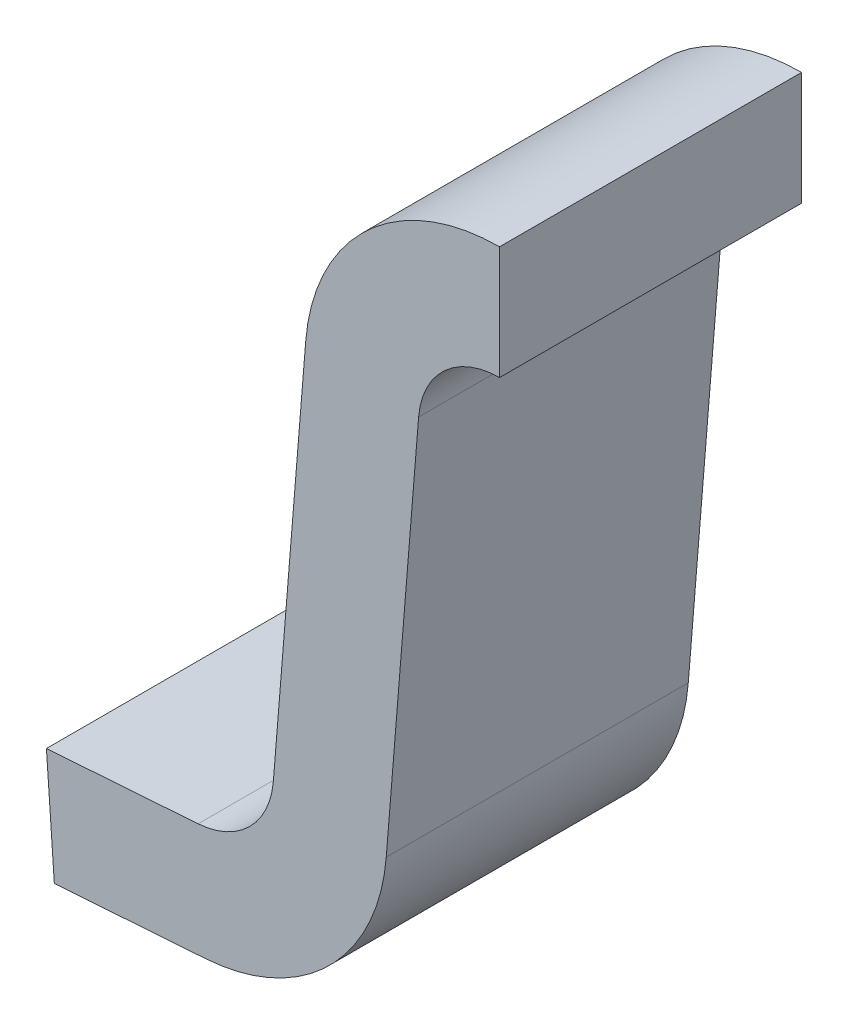
ISO-10303-21;
HEADER;
FILE_DESCRIPTION(('STEP AP214'),'2;1');
FILE_NAME('part.step','',(''),(''),'','','');
FILE_SCHEMA(('AUTOMOTIVE_DESIGN { 1 0 10303 214 1 1 1 1 }'));
ENDSEC;
DATA;
#1=APPLICATION_CONTEXT('core data for automotive mechanical design processes');
#2=APPLICATION_PROTOCOL_DEFINITION('international standard','automotive_design',2000,#1);
#3=PRODUCT_CONTEXT('',#1,'mechanical');
#4=PRODUCT('Part','Part','',(#3));
#5=PRODUCT_RELATED_PRODUCT_CATEGORY('part','',(#4));
#6=PRODUCT_DEFINITION_FORMATION('','',#4);
#7=PRODUCT_DEFINITION_CONTEXT('part definition',#1,'design');
#8=PRODUCT_DEFINITION('design','',#6,#7);
#9=PRODUCT_DEFINITION_SHAPE('','',#8);
#10=(LENGTH_UNIT() NAMED_UNIT(*) SI_UNIT(.MILLI.,.METRE.));
#11=(NAMED_UNIT(*) PLANE_ANGLE_UNIT() SI_UNIT($,.RADIAN.));
#12=(NAMED_UNIT(*) SI_UNIT($,.STERADIAN.) SOLID_ANGLE_UNIT());
#13=UNCERTAINTY_MEASURE_WITH_UNIT(LENGTH_MEASURE(1.E-05),#10,'distance_accuracy_value','');
#14=(GEOMETRIC_REPRESENTATION_CONTEXT(3) GLOBAL_UNCERTAINTY_ASSIGNED_CONTEXT((#13)) GLOBAL_UNIT_ASSIGNED_CONTEXT((#10,
#11,#12)) REPRESENTATION_CONTEXT('',''));
#15=CARTESIAN_POINT('',(0.,0.,0.));
#16=DIRECTION('',(0.,0.,1.));
#17=DIRECTION('',(1.,0.,0.));
#18=AXIS2_PLACEMENT_3D('',#15,#16,#17);
#19=CARTESIAN_POINT('',(-0.8,0.767512637046,0.2));
#20=DIRECTION('',(0.,0.,-1.));
#21=DIRECTION('',(-1.,0.,0.));
#22=AXIS2_PLACEMENT_3D('',#19,#20,#21);
#23=CYLINDRICAL_SURFACE('',#22,0.107487362954);
#24=CARTESIAN_POINT('',(-0.8,0.767512637046,-0.2));
#25=DIRECTION('',(0.,0.,-1.));
#26=DIRECTION('',(1.,0.,0.));
#27=AXIS2_PLACEMENT_3D('',#24,#25,#26);
#28=CIRCLE('',#27,0.107487362954);
#29=CARTESIAN_POINT('',(-0.907132499112,0.776239654222,-0.2));
#30=VERTEX_POINT('',#29);
#31=CARTESIAN_POINT('',(-0.8,0.875,-0.2));
#32=VERTEX_POINT('',#31);
#33=EDGE_CURVE('E11',#30,#32,#28,.T.);
#34=ORIENTED_EDGE('',*,*,#33,.T.);
#35=DIRECTION('',(0.,0.,-1.));
#36=VECTOR('',#35,1.);
#37=CARTESIAN_POINT('',(-0.8,0.875,0.2));
#38=LINE('',#37,#36);
#39=CARTESIAN_POINT('',(-0.8,0.875,0.2));
#40=VERTEX_POINT('',#39);
#41=EDGE_CURVE('E36',#40,#32,#38,.T.);
#42=ORIENTED_EDGE('',*,*,#41,.F.);
#43=CARTESIAN_POINT('',(-0.8,0.767512637046,0.2));
#44=DIRECTION('',(0.,0.,-1.));
#45=DIRECTION('',(1.,0.,0.));
#46=AXIS2_PLACEMENT_3D('',#43,#44,#45);
#47=CIRCLE('',#46,0.107487362954);
#48=CARTESIAN_POINT('',(-0.907132499112,0.776239654222,0.2));
#49=VERTEX_POINT('',#48);
#50=EDGE_CURVE('E110',#49,#40,#47,.T.);
#51=ORIENTED_EDGE('',*,*,#50,.F.);
#52=DIRECTION('',(0.,0.,-1.));
#53=VECTOR('',#52,1.);
#54=CARTESIAN_POINT('',(-0.907132499112,0.776239654222,0.2));
#55=LINE('',#54,#53);
#56=EDGE_CURVE('E27',#49,#30,#55,.T.);
#57=ORIENTED_EDGE('',*,*,#56,.T.);
#58=EDGE_LOOP('',(#34,#42,#51,#57));
#59=FACE_BOUND('',#58,.T.);
#60=ADVANCED_FACE('F17',(#59),#23,.F.);
#61=CARTESIAN_POINT('',(-0.8,1.025,0.2));
#62=DIRECTION('',(-1.,0.,0.));
#63=DIRECTION('',(0.,0.,1.));
#64=AXIS2_PLACEMENT_3D('',#61,#62,#63);
#65=PLANE('',#64);
#66=DIRECTION('',(0.,1.,0.));
#67=VECTOR('',#66,1.);
#68=CARTESIAN_POINT('',(-0.8,1.025,-0.2));
#69=LINE('',#68,#67);
#70=CARTESIAN_POINT('',(-0.8,1.025,-0.2));
#71=VERTEX_POINT('',#70);
#72=EDGE_CURVE('E117',#32,#71,#69,.T.);
#73=ORIENTED_EDGE('',*,*,#72,.T.);
#74=DIRECTION('',(0.,0.,-1.));
#75=VECTOR('',#74,1.);
#76=CARTESIAN_POINT('',(-0.8,1.025,0.2));
#77=LINE('',#76,#75);
#78=CARTESIAN_POINT('',(-0.8,1.025,0.2));
#79=VERTEX_POINT('',#78);
#80=EDGE_CURVE('E123',#79,#71,#77,.T.);
#81=ORIENTED_EDGE('',*,*,#80,.F.);
#82=DIRECTION('',(0.,1.,0.));
#83=VECTOR('',#82,1.);
#84=CARTESIAN_POINT('',(-0.8,1.025,0.2));
#85=LINE('',#84,#83);
#86=EDGE_CURVE('E127',#40,#79,#85,.T.);
#87=ORIENTED_EDGE('',*,*,#86,.F.);
#88=ORIENTED_EDGE('',*,*,#41,.T.);
#89=EDGE_LOOP('',(#73,#81,#87,#88));
#90=FACE_BOUND('',#89,.T.);
#91=ADVANCED_FACE('F177',(#90),#65,.F.);
#92=CARTESIAN_POINT('',(-0.8,0.767512637046,0.2));
#93=DIRECTION('',(0.,0.,-1.));
#94=DIRECTION('',(-1.,0.,0.));
#95=AXIS2_PLACEMENT_3D('',#92,#93,#94);
#96=CYLINDRICAL_SURFACE('',#95,0.257487362954);
#97=CARTESIAN_POINT('',(-0.8,0.767512637046,-0.2));
#98=DIRECTION('',(0.,0.,1.));
#99=DIRECTION('',(1.,0.,0.));
#100=AXIS2_PLACEMENT_3D('',#97,#98,#99);
#101=CIRCLE('',#100,0.257487362954);
#102=CARTESIAN_POINT('',(-1.056637282048,0.788418319139,-0.2));
#103=VERTEX_POINT('',#102);
#104=EDGE_CURVE('E125',#71,#103,#101,.T.);
#105=ORIENTED_EDGE('',*,*,#104,.T.);
#106=DIRECTION('',(0.,0.,-1.));
#107=VECTOR('',#106,1.);
#108=CARTESIAN_POINT('',(-1.056637282048,0.788418319139,0.2));
#109=LINE('',#108,#107);
#110=CARTESIAN_POINT('',(-1.056637282048,0.788418319139,0.2));
#111=VERTEX_POINT('',#110);
#112=EDGE_CURVE('E132',#111,#103,#109,.T.);
#113=ORIENTED_EDGE('',*,*,#112,.F.);
#114=CARTESIAN_POINT('',(-0.8,0.767512637046,0.2));
#115=DIRECTION('',(0.,0.,1.));
#116=DIRECTION('',(1.,0.,0.));
#117=AXIS2_PLACEMENT_3D('',#114,#115,#116);
#118=CIRCLE('',#117,0.257487362954);
#119=EDGE_CURVE('E129',#79,#111,#118,.T.);
#120=ORIENTED_EDGE('',*,*,#119,.F.);
#121=ORIENTED_EDGE('',*,*,#80,.T.);
#122=EDGE_LOOP('',(#105,#113,#120,#121));
#123=FACE_BOUND('',#122,.T.);
#124=ADVANCED_FACE('F183',(#123),#96,.T.);
#125=CARTESIAN_POINT('',(-1.056637282048,0.788418319139,0.2));
#126=DIRECTION('',(0.996698552908398,-0.0811910994525024,0.));
#127=DIRECTION('',(0.0811910994525024,0.996698552908398,0.));
#128=AXIS2_PLACEMENT_3D('',#125,#126,#127);
#129=PLANE('',#128);
#130=DIRECTION('',(-0.0811910994525024,-0.996698552908398,0.));
#131=VECTOR('',#130,1.);
#132=CARTESIAN_POINT('',(-1.056637282048,0.788418319139,-0.2));
#133=LINE('',#132,#131);
#134=CARTESIAN_POINT('',(-1.099504782936,0.262178664918,-0.2));
#135=VERTEX_POINT('',#134);
#136=EDGE_CURVE('E126',#103,#135,#133,.T.);
#137=ORIENTED_EDGE('',*,*,#136,.T.);
#138=DIRECTION('',(0.,0.,-1.));
#139=VECTOR('',#138,1.);
#140=CARTESIAN_POINT('',(-1.099504782936,0.262178664918,0.2));
#141=LINE('',#140,#139);
#142=CARTESIAN_POINT('',(-1.099504782936,0.262178664918,0.2));
#143=VERTEX_POINT('',#142);
#144=EDGE_CURVE('E139',#143,#135,#141,.T.);
#145=ORIENTED_EDGE('',*,*,#144,.F.);
#146=DIRECTION('',(-0.0811910994525024,-0.996698552908398,0.));
#147=VECTOR('',#146,1.);
#148=CARTESIAN_POINT('',(-1.056637282048,0.788418319139,0.2));
#149=LINE('',#148,#147);
#150=EDGE_CURVE('E136',#111,#143,#149,.T.);
#151=ORIENTED_EDGE('',*,*,#150,.F.);
#152=ORIENTED_EDGE('',*,*,#112,.T.);
#153=EDGE_LOOP('',(#137,#145,#151,#152));
#154=FACE_BOUND('',#153,.T.);
#155=ADVANCED_FACE('F186',(#154),#129,.F.);
#156=CARTESIAN_POINT('',(-1.206637282048,0.270905682093,0.2));
#157=DIRECTION('',(0.,0.,-1.));
#158=DIRECTION('',(-1.,0.,0.));
#159=AXIS2_PLACEMENT_3D('',#156,#157,#158);
#160=CYLINDRICAL_SURFACE('',#159,0.107487362954);
#161=CARTESIAN_POINT('',(-1.206637282048,0.270905682093,-0.2));
#162=DIRECTION('',(0.,0.,-1.));
#163=DIRECTION('',(-1.,0.,0.));
#164=AXIS2_PLACEMENT_3D('',#161,#162,#163);
#165=CIRCLE('',#164,0.107487362954);
#166=CARTESIAN_POINT('',(-1.199139342637,0.163680152953,-0.2));
#167=VERTEX_POINT('',#166);
#168=EDGE_CURVE('E134',#135,#167,#165,.T.);
#169=ORIENTED_EDGE('',*,*,#168,.T.);
#170=DIRECTION('',(0.,0.,-1.));
#171=VECTOR('',#170,1.);
#172=CARTESIAN_POINT('',(-1.199139342637,0.163680152953,0.2));
#173=LINE('',#172,#171);
#174=CARTESIAN_POINT('',(-1.199139342637,0.163680152953,0.2));
#175=VERTEX_POINT('',#174);
#176=EDGE_CURVE('E146',#175,#167,#173,.T.);
#177=ORIENTED_EDGE('',*,*,#176,.F.);
#178=CARTESIAN_POINT('',(-1.206637282048,0.270905682093,0.2));
#179=DIRECTION('',(0.,0.,-1.));
#180=DIRECTION('',(-1.,0.,0.));
#181=AXIS2_PLACEMENT_3D('',#178,#179,#180);
#182=CIRCLE('',#181,0.107487362954);
#183=EDGE_CURVE('E143',#143,#175,#182,.T.);
#184=ORIENTED_EDGE('',*,*,#183,.F.);
#185=ORIENTED_EDGE('',*,*,#144,.T.);
#186=EDGE_LOOP('',(#169,#177,#184,#185));
#187=FACE_BOUND('',#186,.T.);
#188=ADVANCED_FACE('F191',(#187),#160,.F.);
#189=CARTESIAN_POINT('',(-1.199139342637,0.163680152953,0.2));
#190=DIRECTION('',(0.0697564737441078,-0.997564050259825,0.));
#191=DIRECTION('',(0.997564050259826,0.0697564737441078,0.));
#192=AXIS2_PLACEMENT_3D('',#189,#190,#191);
#193=PLANE('',#192);
#194=DIRECTION('',(-0.997564050259825,-0.0697564737441078,0.));
#195=VECTOR('',#194,1.);
#196=CARTESIAN_POINT('',(-1.199139342637,0.163680152953,-0.2));
#197=LINE('',#196,#195);
#198=CARTESIAN_POINT('',(-1.4,0.149634607539,-0.2));
#199=VERTEX_POINT('',#198);
#200=EDGE_CURVE('E141',#167,#199,#197,.T.);
#201=ORIENTED_EDGE('',*,*,#200,.T.);
#202=DIRECTION('',(0.,0.,-1.));
#203=VECTOR('',#202,1.);
#204=CARTESIAN_POINT('',(-1.4,0.149634607539,0.2));
#205=LINE('',#204,#203);
#206=CARTESIAN_POINT('',(-1.4,0.149634607539,0.2));
#207=VERTEX_POINT('',#206);
#208=EDGE_CURVE('E153',#207,#199,#205,.T.);
#209=ORIENTED_EDGE('',*,*,#208,.F.);
#210=DIRECTION('',(-0.997564050259825,-0.0697564737441078,0.));
#211=VECTOR('',#210,1.);
#212=CARTESIAN_POINT('',(-1.199139342637,0.163680152953,0.2));
#213=LINE('',#212,#211);
#214=EDGE_CURVE('E150',#175,#207,#213,.T.);
#215=ORIENTED_EDGE('',*,*,#214,.F.);
#216=ORIENTED_EDGE('',*,*,#176,.T.);
#217=EDGE_LOOP('',(#201,#209,#215,#216));
#218=FACE_BOUND('',#217,.T.);
#219=ADVANCED_FACE('F196',(#218),#193,.F.);
#220=CARTESIAN_POINT('',(-1.4,0.149634607539,0.2));
#221=DIRECTION('',(0.997564050259825,0.0697564737441078,0.));
#222=DIRECTION('',(-0.0697564737441078,0.997564050259826,0.));
#223=AXIS2_PLACEMENT_3D('',#220,#221,#222);
#224=PLANE('',#223);
#225=DIRECTION('',(0.0697564737441078,-0.997564050259825,0.));
#226=VECTOR('',#225,1.);
#227=CARTESIAN_POINT('',(-1.4,0.149634607539,-0.2));
#228=LINE('',#227,#226);
#229=CARTESIAN_POINT('',(-1.389536528938,0.,-0.2));
#230=VERTEX_POINT('',#229);
#231=EDGE_CURVE('E148',#199,#230,#228,.T.);
#232=ORIENTED_EDGE('',*,*,#231,.T.);
#233=DIRECTION('',(0.,0.,-1.));
#234=VECTOR('',#233,1.);
#235=CARTESIAN_POINT('',(-1.389536528938,0.,0.2));
#236=LINE('',#235,#234);
#237=CARTESIAN_POINT('',(-1.389536528938,0.,0.2));
#238=VERTEX_POINT('',#237);
#239=EDGE_CURVE('E160',#238,#230,#236,.T.);
#240=ORIENTED_EDGE('',*,*,#239,.F.);
#241=DIRECTION('',(0.0697564737441078,-0.997564050259825,0.));
#242=VECTOR('',#241,1.);
#243=CARTESIAN_POINT('',(-1.4,0.149634607539,0.2));
#244=LINE('',#243,#242);
#245=EDGE_CURVE('E157',#207,#238,#244,.T.);
#246=ORIENTED_EDGE('',*,*,#245,.F.);
#247=ORIENTED_EDGE('',*,*,#208,.T.);
#248=EDGE_LOOP('',(#232,#240,#246,#247));
#249=FACE_BOUND('',#248,.T.);
#250=ADVANCED_FACE('F199',(#249),#224,.F.);
#251=CARTESIAN_POINT('',(-1.188675871575,0.01404554541429,0.2));
#252=DIRECTION('',(-0.0697564737441078,0.997564050259825,0.));
#253=DIRECTION('',(-0.997564050259826,-0.0697564737441078,0.));
#254=AXIS2_PLACEMENT_3D('',#251,#252,#253);
#255=PLANE('',#254);
#256=DIRECTION('',(0.997564050259825,0.0697564737441078,0.));
#257=VECTOR('',#256,1.);
#258=CARTESIAN_POINT('',(-1.188675871575,0.01404554541429,-0.2));
#259=LINE('',#258,#257);
#260=CARTESIAN_POINT('',(-1.188675871575,0.01404554541429,-0.2));
#261=VERTEX_POINT('',#260);
#262=EDGE_CURVE('E155',#230,#261,#259,.T.);
#263=ORIENTED_EDGE('',*,*,#262,.T.);
#264=DIRECTION('',(0.,0.,-1.));
#265=VECTOR('',#264,1.);
#266=CARTESIAN_POINT('',(-1.188675871575,0.01404554541429,0.2));
#267=LINE('',#266,#265);
#268=CARTESIAN_POINT('',(-1.188675871575,0.01404554541429,0.2));
#269=VERTEX_POINT('',#268);
#270=EDGE_CURVE('E165',#269,#261,#267,.T.);
#271=ORIENTED_EDGE('',*,*,#270,.F.);
#272=DIRECTION('',(0.997564050259825,0.0697564737441078,0.));
#273=VECTOR('',#272,1.);
#274=CARTESIAN_POINT('',(-1.188675871575,0.01404554541429,0.2));
#275=LINE('',#274,#273);
#276=EDGE_CURVE('E101',#238,#269,#275,.T.);
#277=ORIENTED_EDGE('',*,*,#276,.F.);
#278=ORIENTED_EDGE('',*,*,#239,.T.);
#279=EDGE_LOOP('',(#263,#271,#277,#278));
#280=FACE_BOUND('',#279,.T.);
#281=ADVANCED_FACE('F170',(#280),#255,.F.);
#282=CARTESIAN_POINT('',(-1.206637282048,0.270905682093,0.2));
#283=DIRECTION('',(0.,0.,-1.));
#284=DIRECTION('',(-1.,0.,0.));
#285=AXIS2_PLACEMENT_3D('',#282,#283,#284);
#286=CYLINDRICAL_SURFACE('',#285,0.257487362954);
#287=CARTESIAN_POINT('',(-1.206637282048,0.270905682093,-0.2));
#288=DIRECTION('',(0.,0.,1.));
#289=DIRECTION('',(-1.,0.,0.));
#290=AXIS2_PLACEMENT_3D('',#287,#288,#289);
#291=CIRCLE('',#290,0.257487362954);
#292=CARTESIAN_POINT('',(-0.95,0.25,-0.2));
#293=VERTEX_POINT('',#292);
#294=EDGE_CURVE('E107',#261,#293,#291,.T.);
#295=ORIENTED_EDGE('',*,*,#294,.T.);
#296=DIRECTION('',(0.,0.,-1.));
#297=VECTOR('',#296,1.);
#298=CARTESIAN_POINT('',(-0.95,0.25,0.2));
#299=LINE('',#298,#297);
#300=CARTESIAN_POINT('',(-0.95,0.25,0.2));
#301=VERTEX_POINT('',#300);
#302=EDGE_CURVE('E92',#301,#293,#299,.T.);
#303=ORIENTED_EDGE('',*,*,#302,.F.);
#304=CARTESIAN_POINT('',(-1.206637282048,0.270905682093,0.2));
#305=DIRECTION('',(0.,0.,1.));
#306=DIRECTION('',(-1.,0.,0.));
#307=AXIS2_PLACEMENT_3D('',#304,#305,#306);
#308=CIRCLE('',#307,0.257487362954);
#309=EDGE_CURVE('E98',#269,#301,#308,.T.);
#310=ORIENTED_EDGE('',*,*,#309,.F.);
#311=ORIENTED_EDGE('',*,*,#270,.T.);
#312=EDGE_LOOP('',(#295,#303,#310,#311));
#313=FACE_BOUND('',#312,.T.);
#314=ADVANCED_FACE('F105',(#313),#286,.T.);
#315=CARTESIAN_POINT('',(-0.907132499112,0.776239654222,0.2));
#316=DIRECTION('',(-0.996698552908398,0.0811910994525024,0.));
#317=DIRECTION('',(-0.0811910994525024,-0.996698552908398,0.));
#318=AXIS2_PLACEMENT_3D('',#315,#316,#317);
#319=PLANE('',#318);
#320=DIRECTION('',(0.0811910994525024,0.996698552908398,0.));
#321=VECTOR('',#320,1.);
#322=CARTESIAN_POINT('',(-0.907132499112,0.776239654222,-0.2));
#323=LINE('',#322,#321);
#324=EDGE_CURVE('E109',#293,#30,#323,.T.);
#325=ORIENTED_EDGE('',*,*,#324,.T.);
#326=ORIENTED_EDGE('',*,*,#56,.F.);
#327=DIRECTION('',(0.0811910994525024,0.996698552908398,0.));
#328=VECTOR('',#327,1.);
#329=CARTESIAN_POINT('',(-0.907132499112,0.776239654222,0.2));
#330=LINE('',#329,#328);
#331=EDGE_CURVE('E21',#301,#49,#330,.T.);
#332=ORIENTED_EDGE('',*,*,#331,.F.);
#333=ORIENTED_EDGE('',*,*,#302,.T.);
#334=EDGE_LOOP('',(#325,#326,#332,#333));
#335=FACE_BOUND('',#334,.T.);
#336=ADVANCED_FACE('F113',(#335),#319,.F.);
#337=CARTESIAN_POINT('',(-0.8,0.767512637046,0.2));
#338=DIRECTION('',(0.,0.,1.));
#339=DIRECTION('',(1.,0.,0.));
#340=AXIS2_PLACEMENT_3D('',#337,#338,#339);
#341=PLANE('',#340);
#342=ORIENTED_EDGE('',*,*,#50,.T.);
#343=ORIENTED_EDGE('',*,*,#86,.T.);
#344=ORIENTED_EDGE('',*,*,#119,.T.);
#345=ORIENTED_EDGE('',*,*,#150,.T.);
#346=ORIENTED_EDGE('',*,*,#183,.T.);
#347=ORIENTED_EDGE('',*,*,#214,.T.);
#348=ORIENTED_EDGE('',*,*,#245,.T.);
#349=ORIENTED_EDGE('',*,*,#276,.T.);
#350=ORIENTED_EDGE('',*,*,#309,.T.);
#351=ORIENTED_EDGE('',*,*,#331,.T.);
#352=EDGE_LOOP('',(#342,#343,#344,#345,#346,#347,#348,#349,#350,#351));
#353=FACE_BOUND('',#352,.T.);
#354=ADVANCED_FACE('F99',(#353),#341,.T.);
#355=CARTESIAN_POINT('',(-0.8,0.767512637046,-0.2));
#356=DIRECTION('',(0.,0.,1.));
#357=DIRECTION('',(1.,0.,0.));
#358=AXIS2_PLACEMENT_3D('',#355,#356,#357);
#359=PLANE('',#358);
#360=ORIENTED_EDGE('',*,*,#33,.F.);
#361=ORIENTED_EDGE('',*,*,#324,.F.);
#362=ORIENTED_EDGE('',*,*,#294,.F.);
#363=ORIENTED_EDGE('',*,*,#262,.F.);
#364=ORIENTED_EDGE('',*,*,#231,.F.);
#365=ORIENTED_EDGE('',*,*,#200,.F.);
#366=ORIENTED_EDGE('',*,*,#168,.F.);
#367=ORIENTED_EDGE('',*,*,#136,.F.);
#368=ORIENTED_EDGE('',*,*,#104,.F.);
#369=ORIENTED_EDGE('',*,*,#72,.F.);
#370=EDGE_LOOP('',(#360,#361,#362,#363,#364,#365,#366,#367,#368,#369));
#371=FACE_BOUND('',#370,.T.);
#372=ADVANCED_FACE('F19',(#371),#359,.F.);
#373=CLOSED_SHELL('',(#60,#91,#124,#155,#188,#219,#250,#281,#314,#336,#354,#372));
#374=MANIFOLD_SOLID_BREP('B1',#373);
#375=ADVANCED_BREP_SHAPE_REPRESENTATION('',(#18,#374),#14);
#376=SHAPE_DEFINITION_REPRESENTATION(#9,#375);
ENDSEC;
END-ISO-10303-21;
